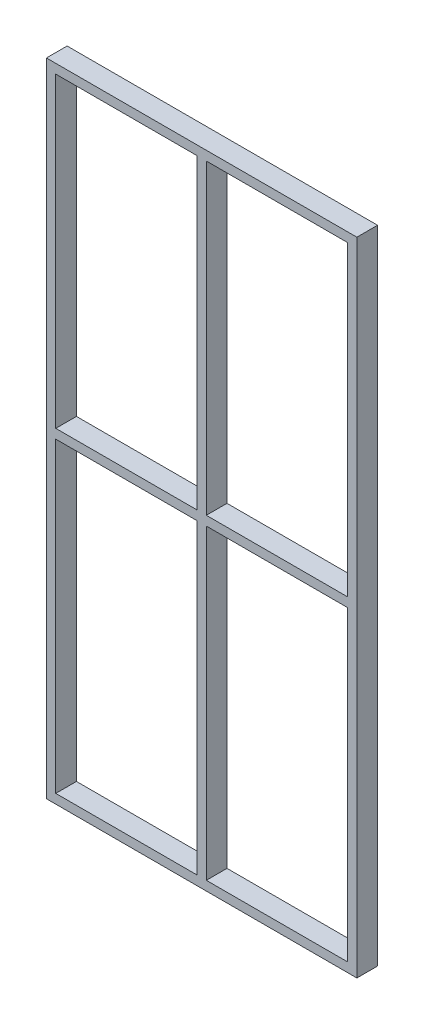
ISO-10303-21;
HEADER;
FILE_DESCRIPTION(('STEP AP214'),'2;1');
FILE_NAME('part.step','',(''),(''),'','','');
FILE_SCHEMA(('AUTOMOTIVE_DESIGN { 1 0 10303 214 1 1 1 1 }'));
ENDSEC;
DATA;
#1=APPLICATION_CONTEXT('core data for automotive mechanical design processes');
#2=APPLICATION_PROTOCOL_DEFINITION('international standard','automotive_design',2000,#1);
#3=PRODUCT_CONTEXT('',#1,'mechanical');
#4=PRODUCT('Part','Part','',(#3));
#5=PRODUCT_RELATED_PRODUCT_CATEGORY('part','',(#4));
#6=PRODUCT_DEFINITION_FORMATION('','',#4);
#7=PRODUCT_DEFINITION_CONTEXT('part definition',#1,'design');
#8=PRODUCT_DEFINITION('design','',#6,#7);
#9=PRODUCT_DEFINITION_SHAPE('','',#8);
#10=(LENGTH_UNIT() NAMED_UNIT(*) SI_UNIT(.MILLI.,.METRE.));
#11=(NAMED_UNIT(*) PLANE_ANGLE_UNIT() SI_UNIT($,.RADIAN.));
#12=(NAMED_UNIT(*) SI_UNIT($,.STERADIAN.) SOLID_ANGLE_UNIT());
#13=UNCERTAINTY_MEASURE_WITH_UNIT(LENGTH_MEASURE(1.E-05),#10,'distance_accuracy_value','');
#14=(GEOMETRIC_REPRESENTATION_CONTEXT(3) GLOBAL_UNCERTAINTY_ASSIGNED_CONTEXT((#13)) GLOBAL_UNIT_ASSIGNED_CONTEXT((#10,
#11,#12)) REPRESENTATION_CONTEXT('',''));
#15=CARTESIAN_POINT('',(0.,0.,0.));
#16=DIRECTION('',(0.,0.,1.));
#17=DIRECTION('',(1.,0.,0.));
#18=AXIS2_PLACEMENT_3D('',#15,#16,#17);
#19=CARTESIAN_POINT('',(27.,1860.,60.));
#20=DIRECTION('',(1.,0.,0.));
#21=DIRECTION('',(0.,1.,0.));
#22=AXIS2_PLACEMENT_3D('',#19,#20,#21);
#23=PLANE('',#22);
#24=DIRECTION('',(0.,-1.,0.));
#25=VECTOR('',#24,1.);
#26=CARTESIAN_POINT('',(27.,1860.,60.));
#27=LINE('',#26,#25);
#28=CARTESIAN_POINT('',(27.,1833.,60.));
#29=VERTEX_POINT('',#28);
#30=CARTESIAN_POINT('',(27.,943.5,60.));
#31=VERTEX_POINT('',#30);
#32=EDGE_CURVE('E72',#29,#31,#27,.T.);
#33=ORIENTED_EDGE('',*,*,#32,.T.);
#34=DIRECTION('',(0.,0.,1.));
#35=VECTOR('',#34,1.);
#36=CARTESIAN_POINT('',(27.,943.5,0.));
#37=LINE('',#36,#35);
#38=CARTESIAN_POINT('',(27.,943.5,0.));
#39=VERTEX_POINT('',#38);
#40=EDGE_CURVE('E215',#39,#31,#37,.T.);
#41=ORIENTED_EDGE('',*,*,#40,.F.);
#42=DIRECTION('',(0.,-1.,0.));
#43=VECTOR('',#42,1.);
#44=CARTESIAN_POINT('',(27.,1860.,0.));
#45=LINE('',#44,#43);
#46=CARTESIAN_POINT('',(27.,1833.,0.));
#47=VERTEX_POINT('',#46);
#48=EDGE_CURVE('E275',#47,#39,#45,.T.);
#49=ORIENTED_EDGE('',*,*,#48,.F.);
#50=DIRECTION('',(0.,0.,-1.));
#51=VECTOR('',#50,1.);
#52=CARTESIAN_POINT('',(27.,1833.,60.));
#53=LINE('',#52,#51);
#54=EDGE_CURVE('E274',#29,#47,#53,.T.);
#55=ORIENTED_EDGE('',*,*,#54,.F.);
#56=EDGE_LOOP('',(#33,#41,#49,#55));
#57=FACE_BOUND('',#56,.T.);
#58=ADVANCED_FACE('F57',(#57),#23,.T.);
#59=CARTESIAN_POINT('',(873.,0.,60.));
#60=DIRECTION('',(-1.,0.,0.));
#61=DIRECTION('',(0.,0.,1.));
#62=AXIS2_PLACEMENT_3D('',#59,#60,#61);
#63=PLANE('',#62);
#64=DIRECTION('',(0.,1.,0.));
#65=VECTOR('',#64,1.);
#66=CARTESIAN_POINT('',(873.,0.,0.));
#67=LINE('',#66,#65);
#68=CARTESIAN_POINT('',(873.,943.5,0.));
#69=VERTEX_POINT('',#68);
#70=CARTESIAN_POINT('',(873.,1833.,0.));
#71=VERTEX_POINT('',#70);
#72=EDGE_CURVE('E212',#69,#71,#67,.T.);
#73=ORIENTED_EDGE('',*,*,#72,.F.);
#74=DIRECTION('',(0.,0.,1.));
#75=VECTOR('',#74,1.);
#76=CARTESIAN_POINT('',(873.,943.5,0.));
#77=LINE('',#76,#75);
#78=CARTESIAN_POINT('',(873.,943.5,60.));
#79=VERTEX_POINT('',#78);
#80=EDGE_CURVE('E210',#69,#79,#77,.T.);
#81=ORIENTED_EDGE('',*,*,#80,.T.);
#82=DIRECTION('',(0.,1.,0.));
#83=VECTOR('',#82,1.);
#84=CARTESIAN_POINT('',(873.,0.,60.));
#85=LINE('',#84,#83);
#86=CARTESIAN_POINT('',(873.,1833.,60.));
#87=VERTEX_POINT('',#86);
#88=EDGE_CURVE('E194',#79,#87,#85,.T.);
#89=ORIENTED_EDGE('',*,*,#88,.T.);
#90=DIRECTION('',(0.,0.,-1.));
#91=VECTOR('',#90,1.);
#92=CARTESIAN_POINT('',(873.,1833.,60.));
#93=LINE('',#92,#91);
#94=EDGE_CURVE('E291',#87,#71,#93,.T.);
#95=ORIENTED_EDGE('',*,*,#94,.T.);
#96=EDGE_LOOP('',(#73,#81,#89,#95));
#97=FACE_BOUND('',#96,.T.);
#98=ADVANCED_FACE('F211',(#97),#63,.T.);
#99=CARTESIAN_POINT('',(463.5,27.,0.));
#100=DIRECTION('',(1.,0.,0.));
#101=DIRECTION('',(0.,1.,0.));
#102=AXIS2_PLACEMENT_3D('',#99,#100,#101);
#103=PLANE('',#102);
#104=DIRECTION('',(0.,1.,0.));
#105=VECTOR('',#104,1.);
#106=CARTESIAN_POINT('',(463.5,27.,60.));
#107=LINE('',#106,#105);
#108=CARTESIAN_POINT('',(463.5,943.5,60.));
#109=VERTEX_POINT('',#108);
#110=CARTESIAN_POINT('',(463.5,1833.,60.));
#111=VERTEX_POINT('',#110);
#112=EDGE_CURVE('E241',#109,#111,#107,.T.);
#113=ORIENTED_EDGE('',*,*,#112,.F.);
#114=DIRECTION('',(0.,0.,-1.));
#115=VECTOR('',#114,1.);
#116=CARTESIAN_POINT('',(463.5,943.5,0.));
#117=LINE('',#116,#115);
#118=CARTESIAN_POINT('',(463.5,943.5,0.));
#119=VERTEX_POINT('',#118);
#120=EDGE_CURVE('E220',#109,#119,#117,.T.);
#121=ORIENTED_EDGE('',*,*,#120,.T.);
#122=DIRECTION('',(0.,1.,0.));
#123=VECTOR('',#122,1.);
#124=CARTESIAN_POINT('',(463.5,27.,0.));
#125=LINE('',#124,#123);
#126=CARTESIAN_POINT('',(463.5,1833.,0.));
#127=VERTEX_POINT('',#126);
#128=EDGE_CURVE('E246',#119,#127,#125,.T.);
#129=ORIENTED_EDGE('',*,*,#128,.T.);
#130=DIRECTION('',(0.,0.,1.));
#131=VECTOR('',#130,1.);
#132=CARTESIAN_POINT('',(463.5,1833.,0.));
#133=LINE('',#132,#131);
#134=EDGE_CURVE('E250',#127,#111,#133,.T.);
#135=ORIENTED_EDGE('',*,*,#134,.T.);
#136=EDGE_LOOP('',(#113,#121,#129,#135));
#137=FACE_BOUND('',#136,.T.);
#138=ADVANCED_FACE('F386',(#137),#103,.T.);
#139=CARTESIAN_POINT('',(436.5,27.,0.));
#140=DIRECTION('',(1.,0.,0.));
#141=DIRECTION('',(0.,1.,0.));
#142=AXIS2_PLACEMENT_3D('',#139,#140,#141);
#143=PLANE('',#142);
#144=DIRECTION('',(0.,0.,-1.));
#145=VECTOR('',#144,1.);
#146=CARTESIAN_POINT('',(436.5,943.5,0.));
#147=LINE('',#146,#145);
#148=CARTESIAN_POINT('',(436.5,943.5,60.));
#149=VERTEX_POINT('',#148);
#150=CARTESIAN_POINT('',(436.5,943.5,0.));
#151=VERTEX_POINT('',#150);
#152=EDGE_CURVE('E65',#149,#151,#147,.T.);
#153=ORIENTED_EDGE('',*,*,#152,.F.);
#154=DIRECTION('',(0.,1.,0.));
#155=VECTOR('',#154,1.);
#156=CARTESIAN_POINT('',(436.5,27.,60.));
#157=LINE('',#156,#155);
#158=CARTESIAN_POINT('',(436.5,1833.,60.));
#159=VERTEX_POINT('',#158);
#160=EDGE_CURVE('E254',#149,#159,#157,.T.);
#161=ORIENTED_EDGE('',*,*,#160,.T.);
#162=DIRECTION('',(0.,0.,1.));
#163=VECTOR('',#162,1.);
#164=CARTESIAN_POINT('',(436.5,1833.,0.));
#165=LINE('',#164,#163);
#166=CARTESIAN_POINT('',(436.5,1833.,0.));
#167=VERTEX_POINT('',#166);
#168=EDGE_CURVE('E263',#167,#159,#165,.T.);
#169=ORIENTED_EDGE('',*,*,#168,.F.);
#170=DIRECTION('',(0.,1.,0.));
#171=VECTOR('',#170,1.);
#172=CARTESIAN_POINT('',(436.5,27.,0.));
#173=LINE('',#172,#171);
#174=EDGE_CURVE('E245',#151,#167,#173,.T.);
#175=ORIENTED_EDGE('',*,*,#174,.F.);
#176=EDGE_LOOP('',(#153,#161,#169,#175));
#177=FACE_BOUND('',#176,.T.);
#178=ADVANCED_FACE('F475',(#177),#143,.F.);
#179=CARTESIAN_POINT('',(0.,27.,60.));
#180=DIRECTION('',(0.,1.,0.));
#181=DIRECTION('',(0.,0.,1.));
#182=AXIS2_PLACEMENT_3D('',#179,#180,#181);
#183=PLANE('',#182);
#184=DIRECTION('',(1.,0.,0.));
#185=VECTOR('',#184,1.);
#186=CARTESIAN_POINT('',(0.,27.,60.));
#187=LINE('',#186,#185);
#188=CARTESIAN_POINT('',(27.,27.,60.));
#189=VERTEX_POINT('',#188);
#190=CARTESIAN_POINT('',(436.5,27.,60.));
#191=VERTEX_POINT('',#190);
#192=EDGE_CURVE('E207',#189,#191,#187,.T.);
#193=ORIENTED_EDGE('',*,*,#192,.T.);
#194=DIRECTION('',(0.,0.,1.));
#195=VECTOR('',#194,1.);
#196=CARTESIAN_POINT('',(436.5,27.,0.));
#197=LINE('',#196,#195);
#198=CARTESIAN_POINT('',(436.5,27.,0.));
#199=VERTEX_POINT('',#198);
#200=EDGE_CURVE('E260',#199,#191,#197,.T.);
#201=ORIENTED_EDGE('',*,*,#200,.F.);
#202=DIRECTION('',(1.,0.,0.));
#203=VECTOR('',#202,1.);
#204=CARTESIAN_POINT('',(0.,27.,0.));
#205=LINE('',#204,#203);
#206=CARTESIAN_POINT('',(27.,27.,0.));
#207=VERTEX_POINT('',#206);
#208=EDGE_CURVE('E279',#207,#199,#205,.T.);
#209=ORIENTED_EDGE('',*,*,#208,.F.);
#210=DIRECTION('',(0.,0.,-1.));
#211=VECTOR('',#210,1.);
#212=CARTESIAN_POINT('',(27.,27.,60.));
#213=LINE('',#212,#211);
#214=EDGE_CURVE('E296',#189,#207,#213,.T.);
#215=ORIENTED_EDGE('',*,*,#214,.F.);
#216=EDGE_LOOP('',(#193,#201,#209,#215));
#217=FACE_BOUND('',#216,.T.);
#218=ADVANCED_FACE('F376',(#217),#183,.T.);
#219=CARTESIAN_POINT('',(900.,1833.,60.));
#220=DIRECTION('',(0.,-1.,0.));
#221=DIRECTION('',(1.,0.,0.));
#222=AXIS2_PLACEMENT_3D('',#219,#220,#221);
#223=PLANE('',#222);
#224=DIRECTION('',(-1.,0.,0.));
#225=VECTOR('',#224,1.);
#226=CARTESIAN_POINT('',(900.,1833.,0.));
#227=LINE('',#226,#225);
#228=EDGE_CURVE('E285',#167,#47,#227,.T.);
#229=ORIENTED_EDGE('',*,*,#228,.F.);
#230=ORIENTED_EDGE('',*,*,#168,.T.);
#231=DIRECTION('',(-1.,0.,0.));
#232=VECTOR('',#231,1.);
#233=CARTESIAN_POINT('',(900.,1833.,60.));
#234=LINE('',#233,#232);
#235=EDGE_CURVE('E272',#159,#29,#234,.T.);
#236=ORIENTED_EDGE('',*,*,#235,.T.);
#237=ORIENTED_EDGE('',*,*,#54,.T.);
#238=EDGE_LOOP('',(#229,#230,#236,#237));
#239=FACE_BOUND('',#238,.T.);
#240=ADVANCED_FACE('F369',(#239),#223,.T.);
#241=CARTESIAN_POINT('',(0.,0.,60.));
#242=DIRECTION('',(0.,0.,1.));
#243=DIRECTION('',(1.,0.,0.));
#244=AXIS2_PLACEMENT_3D('',#241,#242,#243);
#245=PLANE('',#244);
#246=CARTESIAN_POINT('',(463.5,27.,60.));
#247=VERTEX_POINT('',#246);
#248=CARTESIAN_POINT('',(463.5,916.5,60.));
#249=VERTEX_POINT('',#248);
#250=EDGE_CURVE('E251',#247,#249,#107,.T.);
#251=ORIENTED_EDGE('',*,*,#250,.T.);
#252=DIRECTION('',(1.,0.,0.));
#253=VECTOR('',#252,1.);
#254=CARTESIAN_POINT('',(27.,916.5,60.));
#255=LINE('',#254,#253);
#256=CARTESIAN_POINT('',(873.,916.5,60.));
#257=VERTEX_POINT('',#256);
#258=EDGE_CURVE('E228',#249,#257,#255,.T.);
#259=ORIENTED_EDGE('',*,*,#258,.T.);
#260=CARTESIAN_POINT('',(873.,27.,60.));
#261=VERTEX_POINT('',#260);
#262=EDGE_CURVE('E206',#261,#257,#85,.T.);
#263=ORIENTED_EDGE('',*,*,#262,.F.);
#264=EDGE_CURVE('E269',#247,#261,#187,.T.);
#265=ORIENTED_EDGE('',*,*,#264,.F.);
#266=EDGE_LOOP('',(#251,#259,#263,#265));
#267=FACE_BOUND('',#266,.T.);
#268=DIRECTION('',(1.,0.,0.));
#269=VECTOR('',#268,1.);
#270=CARTESIAN_POINT('',(27.,943.5,60.));
#271=LINE('',#270,#269);
#272=EDGE_CURVE('E199',#109,#79,#271,.T.);
#273=ORIENTED_EDGE('',*,*,#272,.F.);
#274=ORIENTED_EDGE('',*,*,#112,.T.);
#275=EDGE_CURVE('E202',#87,#111,#234,.T.);
#276=ORIENTED_EDGE('',*,*,#275,.F.);
#277=ORIENTED_EDGE('',*,*,#88,.F.);
#278=EDGE_LOOP('',(#273,#274,#276,#277));
#279=FACE_BOUND('',#278,.T.);
#280=EDGE_CURVE('E222',#31,#149,#271,.T.);
#281=ORIENTED_EDGE('',*,*,#280,.F.);
#282=ORIENTED_EDGE('',*,*,#32,.F.);
#283=ORIENTED_EDGE('',*,*,#235,.F.);
#284=ORIENTED_EDGE('',*,*,#160,.F.);
#285=EDGE_LOOP('',(#281,#282,#283,#284));
#286=FACE_BOUND('',#285,.T.);
#287=CARTESIAN_POINT('',(27.,916.5,60.));
#288=VERTEX_POINT('',#287);
#289=CARTESIAN_POINT('',(436.5,916.5,60.));
#290=VERTEX_POINT('',#289);
#291=EDGE_CURVE('E223',#288,#290,#255,.T.);
#292=ORIENTED_EDGE('',*,*,#291,.T.);
#293=EDGE_CURVE('E255',#191,#290,#157,.T.);
#294=ORIENTED_EDGE('',*,*,#293,.F.);
#295=ORIENTED_EDGE('',*,*,#192,.F.);
#296=EDGE_CURVE('E270',#288,#189,#27,.T.);
#297=ORIENTED_EDGE('',*,*,#296,.F.);
#298=EDGE_LOOP('',(#292,#294,#295,#297));
#299=FACE_BOUND('',#298,.T.);
#300=DIRECTION('',(0.,-1.,0.));
#301=VECTOR('',#300,1.);
#302=CARTESIAN_POINT('',(0.,1860.,60.));
#303=LINE('',#302,#301);
#304=CARTESIAN_POINT('',(0.,1860.,60.));
#305=VERTEX_POINT('',#304);
#306=CARTESIAN_POINT('',(0.,0.,60.));
#307=VERTEX_POINT('',#306);
#308=EDGE_CURVE('E299',#305,#307,#303,.T.);
#309=ORIENTED_EDGE('',*,*,#308,.T.);
#310=DIRECTION('',(1.,0.,0.));
#311=VECTOR('',#310,1.);
#312=CARTESIAN_POINT('',(0.,0.,60.));
#313=LINE('',#312,#311);
#314=CARTESIAN_POINT('',(900.,0.,60.));
#315=VERTEX_POINT('',#314);
#316=EDGE_CURVE('E302',#307,#315,#313,.T.);
#317=ORIENTED_EDGE('',*,*,#316,.T.);
#318=DIRECTION('',(0.,1.,0.));
#319=VECTOR('',#318,1.);
#320=CARTESIAN_POINT('',(900.,0.,60.));
#321=LINE('',#320,#319);
#322=CARTESIAN_POINT('',(900.,1860.,60.));
#323=VERTEX_POINT('',#322);
#324=EDGE_CURVE('E305',#315,#323,#321,.T.);
#325=ORIENTED_EDGE('',*,*,#324,.T.);
#326=DIRECTION('',(-1.,0.,0.));
#327=VECTOR('',#326,1.);
#328=CARTESIAN_POINT('',(900.,1860.,60.));
#329=LINE('',#328,#327);
#330=EDGE_CURVE('E307',#323,#305,#329,.T.);
#331=ORIENTED_EDGE('',*,*,#330,.T.);
#332=EDGE_LOOP('',(#309,#317,#325,#331));
#333=FACE_BOUND('',#332,.T.);
#334=ADVANCED_FACE('F196',(#267,#279,#286,#299,#333),#245,.T.);
#335=CARTESIAN_POINT('',(0.,0.,0.));
#336=DIRECTION('',(0.,0.,1.));
#337=DIRECTION('',(1.,0.,0.));
#338=AXIS2_PLACEMENT_3D('',#335,#336,#337);
#339=PLANE('',#338);
#340=DIRECTION('',(1.,0.,0.));
#341=VECTOR('',#340,1.);
#342=CARTESIAN_POINT('',(27.,916.5,0.));
#343=LINE('',#342,#341);
#344=CARTESIAN_POINT('',(463.5,916.5,0.));
#345=VERTEX_POINT('',#344);
#346=CARTESIAN_POINT('',(873.,916.5,0.));
#347=VERTEX_POINT('',#346);
#348=EDGE_CURVE('E226',#345,#347,#343,.T.);
#349=ORIENTED_EDGE('',*,*,#348,.F.);
#350=CARTESIAN_POINT('',(463.5,27.,0.));
#351=VERTEX_POINT('',#350);
#352=EDGE_CURVE('E242',#351,#345,#125,.T.);
#353=ORIENTED_EDGE('',*,*,#352,.F.);
#354=CARTESIAN_POINT('',(873.,27.,0.));
#355=VERTEX_POINT('',#354);
#356=EDGE_CURVE('E278',#351,#355,#205,.T.);
#357=ORIENTED_EDGE('',*,*,#356,.T.);
#358=EDGE_CURVE('E282',#355,#347,#67,.T.);
#359=ORIENTED_EDGE('',*,*,#358,.T.);
#360=EDGE_LOOP('',(#349,#353,#357,#359));
#361=FACE_BOUND('',#360,.T.);
#362=ORIENTED_EDGE('',*,*,#128,.F.);
#363=DIRECTION('',(1.,0.,0.));
#364=VECTOR('',#363,1.);
#365=CARTESIAN_POINT('',(27.,943.5,0.));
#366=LINE('',#365,#364);
#367=EDGE_CURVE('E340',#119,#69,#366,.T.);
#368=ORIENTED_EDGE('',*,*,#367,.T.);
#369=ORIENTED_EDGE('',*,*,#72,.T.);
#370=EDGE_CURVE('E286',#71,#127,#227,.T.);
#371=ORIENTED_EDGE('',*,*,#370,.T.);
#372=EDGE_LOOP('',(#362,#368,#369,#371));
#373=FACE_BOUND('',#372,.T.);
#374=ORIENTED_EDGE('',*,*,#48,.T.);
#375=EDGE_CURVE('E237',#39,#151,#366,.T.);
#376=ORIENTED_EDGE('',*,*,#375,.T.);
#377=ORIENTED_EDGE('',*,*,#174,.T.);
#378=ORIENTED_EDGE('',*,*,#228,.T.);
#379=EDGE_LOOP('',(#374,#376,#377,#378));
#380=FACE_BOUND('',#379,.T.);
#381=CARTESIAN_POINT('',(436.5,916.5,0.));
#382=VERTEX_POINT('',#381);
#383=EDGE_CURVE('E247',#199,#382,#173,.T.);
#384=ORIENTED_EDGE('',*,*,#383,.T.);
#385=CARTESIAN_POINT('',(27.,916.5,0.));
#386=VERTEX_POINT('',#385);
#387=EDGE_CURVE('E341',#386,#382,#343,.T.);
#388=ORIENTED_EDGE('',*,*,#387,.F.);
#389=EDGE_CURVE('E80',#386,#207,#45,.T.);
#390=ORIENTED_EDGE('',*,*,#389,.T.);
#391=ORIENTED_EDGE('',*,*,#208,.T.);
#392=EDGE_LOOP('',(#384,#388,#390,#391));
#393=FACE_BOUND('',#392,.T.);
#394=DIRECTION('',(0.,-1.,0.));
#395=VECTOR('',#394,1.);
#396=CARTESIAN_POINT('',(0.,1860.,0.));
#397=LINE('',#396,#395);
#398=CARTESIAN_POINT('',(0.,1860.,0.));
#399=VERTEX_POINT('',#398);
#400=CARTESIAN_POINT('',(0.,0.,0.));
#401=VERTEX_POINT('',#400);
#402=EDGE_CURVE('E298',#399,#401,#397,.T.);
#403=ORIENTED_EDGE('',*,*,#402,.F.);
#404=DIRECTION('',(-1.,0.,0.));
#405=VECTOR('',#404,1.);
#406=CARTESIAN_POINT('',(900.,1860.,0.));
#407=LINE('',#406,#405);
#408=CARTESIAN_POINT('',(900.,1860.,0.));
#409=VERTEX_POINT('',#408);
#410=EDGE_CURVE('E303',#409,#399,#407,.T.);
#411=ORIENTED_EDGE('',*,*,#410,.F.);
#412=DIRECTION('',(0.,1.,0.));
#413=VECTOR('',#412,1.);
#414=CARTESIAN_POINT('',(900.,0.,0.));
#415=LINE('',#414,#413);
#416=CARTESIAN_POINT('',(900.,0.,0.));
#417=VERTEX_POINT('',#416);
#418=EDGE_CURVE('E314',#417,#409,#415,.T.);
#419=ORIENTED_EDGE('',*,*,#418,.F.);
#420=DIRECTION('',(1.,0.,0.));
#421=VECTOR('',#420,1.);
#422=CARTESIAN_POINT('',(0.,0.,0.));
#423=LINE('',#422,#421);
#424=EDGE_CURVE('E312',#401,#417,#423,.T.);
#425=ORIENTED_EDGE('',*,*,#424,.F.);
#426=EDGE_LOOP('',(#403,#411,#419,#425));
#427=FACE_BOUND('',#426,.T.);
#428=ADVANCED_FACE('F336',(#361,#373,#380,#393,#427),#339,.F.);
#429=CARTESIAN_POINT('',(0.,1860.,60.));
#430=DIRECTION('',(1.,0.,0.));
#431=DIRECTION('',(0.,1.,0.));
#432=AXIS2_PLACEMENT_3D('',#429,#430,#431);
#433=PLANE('',#432);
#434=ORIENTED_EDGE('',*,*,#402,.T.);
#435=DIRECTION('',(0.,0.,-1.));
#436=VECTOR('',#435,1.);
#437=CARTESIAN_POINT('',(0.,0.,60.));
#438=LINE('',#437,#436);
#439=EDGE_CURVE('E325',#307,#401,#438,.T.);
#440=ORIENTED_EDGE('',*,*,#439,.F.);
#441=ORIENTED_EDGE('',*,*,#308,.F.);
#442=DIRECTION('',(0.,0.,-1.));
#443=VECTOR('',#442,1.);
#444=CARTESIAN_POINT('',(0.,1860.,60.));
#445=LINE('',#444,#443);
#446=EDGE_CURVE('E309',#305,#399,#445,.T.);
#447=ORIENTED_EDGE('',*,*,#446,.T.);
#448=EDGE_LOOP('',(#434,#440,#441,#447));
#449=FACE_BOUND('',#448,.T.);
#450=ADVANCED_FACE('F59',(#449),#433,.F.);
#451=CARTESIAN_POINT('',(0.,0.,60.));
#452=DIRECTION('',(0.,1.,0.));
#453=DIRECTION('',(0.,0.,1.));
#454=AXIS2_PLACEMENT_3D('',#451,#452,#453);
#455=PLANE('',#454);
#456=ORIENTED_EDGE('',*,*,#424,.T.);
#457=DIRECTION('',(0.,0.,-1.));
#458=VECTOR('',#457,1.);
#459=CARTESIAN_POINT('',(900.,0.,60.));
#460=LINE('',#459,#458);
#461=EDGE_CURVE('E322',#315,#417,#460,.T.);
#462=ORIENTED_EDGE('',*,*,#461,.F.);
#463=ORIENTED_EDGE('',*,*,#316,.F.);
#464=ORIENTED_EDGE('',*,*,#439,.T.);
#465=EDGE_LOOP('',(#456,#462,#463,#464));
#466=FACE_BOUND('',#465,.T.);
#467=ADVANCED_FACE('F424',(#466),#455,.F.);
#468=CARTESIAN_POINT('',(900.,0.,60.));
#469=DIRECTION('',(-1.,0.,0.));
#470=DIRECTION('',(0.,0.,1.));
#471=AXIS2_PLACEMENT_3D('',#468,#469,#470);
#472=PLANE('',#471);
#473=ORIENTED_EDGE('',*,*,#418,.T.);
#474=DIRECTION('',(0.,0.,-1.));
#475=VECTOR('',#474,1.);
#476=CARTESIAN_POINT('',(900.,1860.,60.));
#477=LINE('',#476,#475);
#478=EDGE_CURVE('E319',#323,#409,#477,.T.);
#479=ORIENTED_EDGE('',*,*,#478,.F.);
#480=ORIENTED_EDGE('',*,*,#324,.F.);
#481=ORIENTED_EDGE('',*,*,#461,.T.);
#482=EDGE_LOOP('',(#473,#479,#480,#481));
#483=FACE_BOUND('',#482,.T.);
#484=ADVANCED_FACE('F395',(#483),#472,.F.);
#485=CARTESIAN_POINT('',(900.,1860.,60.));
#486=DIRECTION('',(0.,-1.,0.));
#487=DIRECTION('',(1.,0.,0.));
#488=AXIS2_PLACEMENT_3D('',#485,#486,#487);
#489=PLANE('',#488);
#490=ORIENTED_EDGE('',*,*,#410,.T.);
#491=ORIENTED_EDGE('',*,*,#446,.F.);
#492=ORIENTED_EDGE('',*,*,#330,.F.);
#493=ORIENTED_EDGE('',*,*,#478,.T.);
#494=EDGE_LOOP('',(#490,#491,#492,#493));
#495=FACE_BOUND('',#494,.T.);
#496=ADVANCED_FACE('F390',(#495),#489,.F.);
#497=DIRECTION('',(0.,0.,1.));
#498=VECTOR('',#497,1.);
#499=CARTESIAN_POINT('',(27.,916.5,0.));
#500=LINE('',#499,#498);
#501=EDGE_CURVE('E232',#386,#288,#500,.T.);
#502=ORIENTED_EDGE('',*,*,#501,.T.);
#503=ORIENTED_EDGE('',*,*,#296,.T.);
#504=ORIENTED_EDGE('',*,*,#214,.T.);
#505=ORIENTED_EDGE('',*,*,#389,.F.);
#506=EDGE_LOOP('',(#502,#503,#504,#505));
#507=FACE_BOUND('',#506,.T.);
#508=ADVANCED_FACE('F382',(#507),#23,.T.);
#509=DIRECTION('',(0.,0.,1.));
#510=VECTOR('',#509,1.);
#511=CARTESIAN_POINT('',(463.5,27.,0.));
#512=LINE('',#511,#510);
#513=EDGE_CURVE('E257',#351,#247,#512,.T.);
#514=ORIENTED_EDGE('',*,*,#513,.T.);
#515=ORIENTED_EDGE('',*,*,#264,.T.);
#516=DIRECTION('',(0.,0.,-1.));
#517=VECTOR('',#516,1.);
#518=CARTESIAN_POINT('',(873.,27.,60.));
#519=LINE('',#518,#517);
#520=EDGE_CURVE('E293',#261,#355,#519,.T.);
#521=ORIENTED_EDGE('',*,*,#520,.T.);
#522=ORIENTED_EDGE('',*,*,#356,.F.);
#523=EDGE_LOOP('',(#514,#515,#521,#522));
#524=FACE_BOUND('',#523,.T.);
#525=ADVANCED_FACE('F361',(#524),#183,.T.);
#526=DIRECTION('',(0.,0.,1.));
#527=VECTOR('',#526,1.);
#528=CARTESIAN_POINT('',(873.,916.5,0.));
#529=LINE('',#528,#527);
#530=EDGE_CURVE('E216',#347,#257,#529,.T.);
#531=ORIENTED_EDGE('',*,*,#530,.F.);
#532=ORIENTED_EDGE('',*,*,#358,.F.);
#533=ORIENTED_EDGE('',*,*,#520,.F.);
#534=ORIENTED_EDGE('',*,*,#262,.T.);
#535=EDGE_LOOP('',(#531,#532,#533,#534));
#536=FACE_BOUND('',#535,.T.);
#537=ADVANCED_FACE('F365',(#536),#63,.T.);
#538=ORIENTED_EDGE('',*,*,#134,.F.);
#539=ORIENTED_EDGE('',*,*,#370,.F.);
#540=ORIENTED_EDGE('',*,*,#94,.F.);
#541=ORIENTED_EDGE('',*,*,#275,.T.);
#542=EDGE_LOOP('',(#538,#539,#540,#541));
#543=FACE_BOUND('',#542,.T.);
#544=ADVANCED_FACE('F379',(#543),#223,.T.);
#545=DIRECTION('',(0.,0.,-1.));
#546=VECTOR('',#545,1.);
#547=CARTESIAN_POINT('',(463.5,916.5,0.));
#548=LINE('',#547,#546);
#549=EDGE_CURVE('E239',#249,#345,#548,.T.);
#550=ORIENTED_EDGE('',*,*,#549,.F.);
#551=ORIENTED_EDGE('',*,*,#250,.F.);
#552=ORIENTED_EDGE('',*,*,#513,.F.);
#553=ORIENTED_EDGE('',*,*,#352,.T.);
#554=EDGE_LOOP('',(#550,#551,#552,#553));
#555=FACE_BOUND('',#554,.T.);
#556=ADVANCED_FACE('F358',(#555),#103,.T.);
#557=ORIENTED_EDGE('',*,*,#293,.T.);
#558=DIRECTION('',(0.,0.,-1.));
#559=VECTOR('',#558,1.);
#560=CARTESIAN_POINT('',(436.5,916.5,0.));
#561=LINE('',#560,#559);
#562=EDGE_CURVE('E12',#290,#382,#561,.T.);
#563=ORIENTED_EDGE('',*,*,#562,.T.);
#564=ORIENTED_EDGE('',*,*,#383,.F.);
#565=ORIENTED_EDGE('',*,*,#200,.T.);
#566=EDGE_LOOP('',(#557,#563,#564,#565));
#567=FACE_BOUND('',#566,.T.);
#568=ADVANCED_FACE('F409',(#567),#143,.F.);
#569=CARTESIAN_POINT('',(27.,943.5,0.));
#570=DIRECTION('',(0.,-1.,0.));
#571=DIRECTION('',(0.,0.,-1.));
#572=AXIS2_PLACEMENT_3D('',#569,#570,#571);
#573=PLANE('',#572);
#574=ORIENTED_EDGE('',*,*,#280,.T.);
#575=ORIENTED_EDGE('',*,*,#152,.T.);
#576=ORIENTED_EDGE('',*,*,#375,.F.);
#577=ORIENTED_EDGE('',*,*,#40,.T.);
#578=EDGE_LOOP('',(#574,#575,#576,#577));
#579=FACE_BOUND('',#578,.T.);
#580=ADVANCED_FACE('F332',(#579),#573,.F.);
#581=CARTESIAN_POINT('',(27.,916.5,0.));
#582=DIRECTION('',(0.,-1.,0.));
#583=DIRECTION('',(0.,0.,-1.));
#584=AXIS2_PLACEMENT_3D('',#581,#582,#583);
#585=PLANE('',#584);
#586=ORIENTED_EDGE('',*,*,#562,.F.);
#587=ORIENTED_EDGE('',*,*,#291,.F.);
#588=ORIENTED_EDGE('',*,*,#501,.F.);
#589=ORIENTED_EDGE('',*,*,#387,.T.);
#590=EDGE_LOOP('',(#586,#587,#588,#589));
#591=FACE_BOUND('',#590,.T.);
#592=ADVANCED_FACE('F400',(#591),#585,.T.);
#593=ORIENTED_EDGE('',*,*,#258,.F.);
#594=ORIENTED_EDGE('',*,*,#549,.T.);
#595=ORIENTED_EDGE('',*,*,#348,.T.);
#596=ORIENTED_EDGE('',*,*,#530,.T.);
#597=EDGE_LOOP('',(#593,#594,#595,#596));
#598=FACE_BOUND('',#597,.T.);
#599=ADVANCED_FACE('F350',(#598),#585,.T.);
#600=ORIENTED_EDGE('',*,*,#120,.F.);
#601=ORIENTED_EDGE('',*,*,#272,.T.);
#602=ORIENTED_EDGE('',*,*,#80,.F.);
#603=ORIENTED_EDGE('',*,*,#367,.F.);
#604=EDGE_LOOP('',(#600,#601,#602,#603));
#605=FACE_BOUND('',#604,.T.);
#606=ADVANCED_FACE('F218',(#605),#573,.F.);
#607=CLOSED_SHELL('',(#58,#98,#138,#178,#218,#240,#334,#428,#450,#467,#484,#496,#508,#525,#537,
#544,#556,#568,#580,#592,#599,#606));
#608=MANIFOLD_SOLID_BREP('B2',#607);
#609=ADVANCED_BREP_SHAPE_REPRESENTATION('',(#18,#608),#14);
#610=SHAPE_DEFINITION_REPRESENTATION(#9,#609);
ENDSEC;
END-ISO-10303-21;
